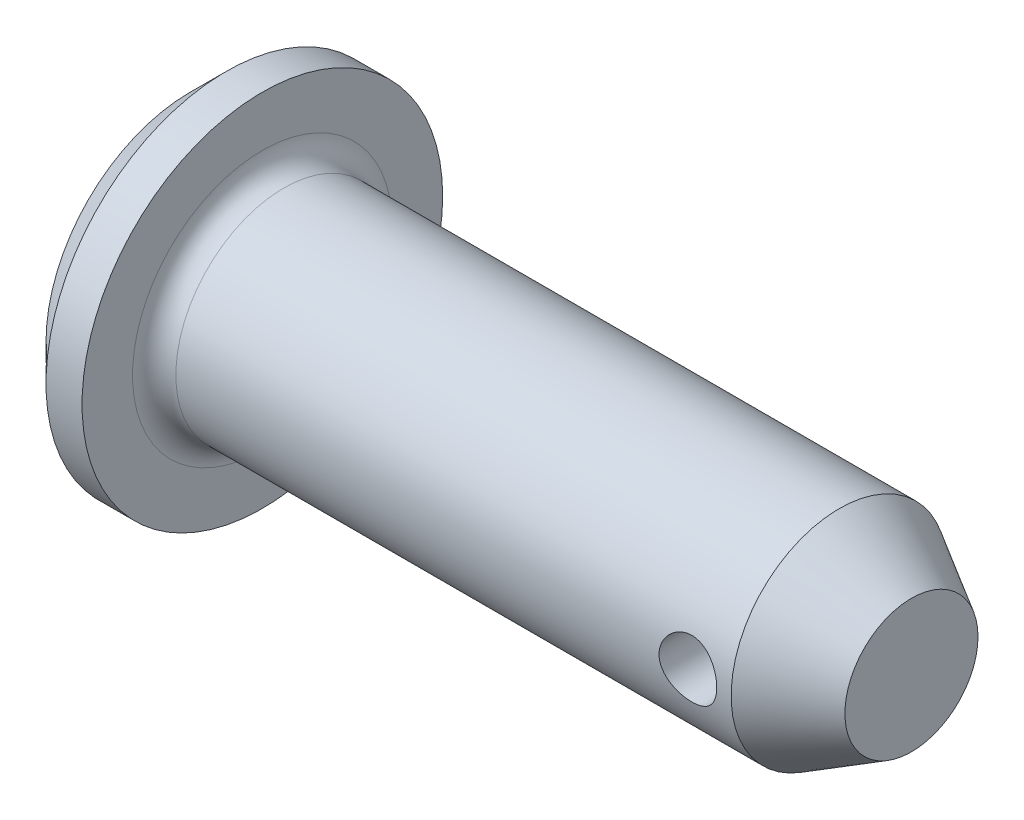
ISO-10303-21;
HEADER;
FILE_DESCRIPTION(('STEP AP214'),'2;1');
FILE_NAME('part.step','',(''),(''),'','','');
FILE_SCHEMA(('AUTOMOTIVE_DESIGN { 1 0 10303 214 1 1 1 1 }'));
ENDSEC;
DATA;
#1=APPLICATION_CONTEXT('core data for automotive mechanical design processes');
#2=APPLICATION_PROTOCOL_DEFINITION('international standard','automotive_design',2000,#1);
#3=PRODUCT_CONTEXT('',#1,'mechanical');
#4=PRODUCT('Part','Part','',(#3));
#5=PRODUCT_RELATED_PRODUCT_CATEGORY('part','',(#4));
#6=PRODUCT_DEFINITION_FORMATION('','',#4);
#7=PRODUCT_DEFINITION_CONTEXT('part definition',#1,'design');
#8=PRODUCT_DEFINITION('design','',#6,#7);
#9=PRODUCT_DEFINITION_SHAPE('','',#8);
#10=(LENGTH_UNIT() NAMED_UNIT(*) SI_UNIT(.MILLI.,.METRE.));
#11=(NAMED_UNIT(*) PLANE_ANGLE_UNIT() SI_UNIT($,.RADIAN.));
#12=(NAMED_UNIT(*) SI_UNIT($,.STERADIAN.) SOLID_ANGLE_UNIT());
#13=UNCERTAINTY_MEASURE_WITH_UNIT(LENGTH_MEASURE(1.E-05),#10,'distance_accuracy_value','');
#14=(GEOMETRIC_REPRESENTATION_CONTEXT(3) GLOBAL_UNCERTAINTY_ASSIGNED_CONTEXT((#13)) GLOBAL_UNIT_ASSIGNED_CONTEXT((#10,
#11,#12)) REPRESENTATION_CONTEXT('',''));
#15=CARTESIAN_POINT('',(0.,0.,0.));
#16=DIRECTION('',(0.,0.,1.));
#17=DIRECTION('',(1.,0.,0.));
#18=AXIS2_PLACEMENT_3D('',#15,#16,#17);
#19=CARTESIAN_POINT('',(0.,0.,0.));
#20=DIRECTION('',(-1.,0.,0.));
#21=DIRECTION('',(0.,0.,1.));
#22=AXIS2_PLACEMENT_3D('',#19,#20,#21);
#23=PLANE('',#22);
#24=CARTESIAN_POINT('',(0.,0.,0.));
#25=DIRECTION('',(1.,0.,0.));
#26=DIRECTION('',(0.,0.,-1.));
#27=AXIS2_PLACEMENT_3D('',#24,#25,#26);
#28=CIRCLE('',#27,4.);
#29=CARTESIAN_POINT('',(0.,0.,-4.));
#30=VERTEX_POINT('',#29);
#31=EDGE_CURVE('E61',#30,#30,#28,.T.);
#32=ORIENTED_EDGE('',*,*,#31,.F.);
#33=EDGE_LOOP('',(#32));
#34=FACE_BOUND('',#33,.T.);
#35=ADVANCED_FACE('F38',(#34),#23,.T.);
#36=CARTESIAN_POINT('',(1.,0.,0.));
#37=DIRECTION('',(1.,0.,0.));
#38=DIRECTION('',(0.,0.,-1.));
#39=AXIS2_PLACEMENT_3D('',#36,#37,#38);
#40=CONICAL_SURFACE('',#39,5.,0.785398163397448);
#41=ORIENTED_EDGE('',*,*,#31,.T.);
#42=EDGE_LOOP('',(#41));
#43=FACE_BOUND('',#42,.T.);
#44=CARTESIAN_POINT('',(1.,0.,0.));
#45=DIRECTION('',(1.,0.,0.));
#46=DIRECTION('',(0.,0.,-1.));
#47=AXIS2_PLACEMENT_3D('',#44,#45,#46);
#48=CIRCLE('',#47,5.);
#49=CARTESIAN_POINT('',(1.,0.,-5.));
#50=VERTEX_POINT('',#49);
#51=EDGE_CURVE('E126',#50,#50,#48,.T.);
#52=ORIENTED_EDGE('',*,*,#51,.F.);
#53=EDGE_LOOP('',(#52));
#54=FACE_BOUND('',#53,.T.);
#55=ADVANCED_FACE('F93',(#43,#54),#40,.T.);
#56=CARTESIAN_POINT('',(0.,0.,0.));
#57=DIRECTION('',(1.,0.,0.));
#58=DIRECTION('',(0.,0.,-1.));
#59=AXIS2_PLACEMENT_3D('',#56,#57,#58);
#60=CYLINDRICAL_SURFACE('',#59,5.);
#61=ORIENTED_EDGE('',*,*,#51,.T.);
#62=EDGE_LOOP('',(#61));
#63=FACE_BOUND('',#62,.T.);
#64=CARTESIAN_POINT('',(2.,0.,0.));
#65=DIRECTION('',(1.,0.,0.));
#66=DIRECTION('',(0.,0.,-1.));
#67=AXIS2_PLACEMENT_3D('',#64,#65,#66);
#68=CIRCLE('',#67,5.);
#69=CARTESIAN_POINT('',(2.,0.,-5.));
#70=VERTEX_POINT('',#69);
#71=EDGE_CURVE('E70',#70,#70,#68,.T.);
#72=ORIENTED_EDGE('',*,*,#71,.F.);
#73=EDGE_LOOP('',(#72));
#74=FACE_BOUND('',#73,.T.);
#75=ADVANCED_FACE('F99',(#63,#74),#60,.T.);
#76=CARTESIAN_POINT('',(2.,5.,0.));
#77=DIRECTION('',(1.,0.,0.));
#78=DIRECTION('',(0.,0.,-1.));
#79=AXIS2_PLACEMENT_3D('',#76,#77,#78);
#80=PLANE('',#79);
#81=CARTESIAN_POINT('',(2.,0.,0.));
#82=DIRECTION('',(1.,0.,0.));
#83=DIRECTION('',(0.,0.,-1.));
#84=AXIS2_PLACEMENT_3D('',#81,#82,#83);
#85=CIRCLE('',#84,3.6);
#86=CARTESIAN_POINT('',(2.,0.,-3.6));
#87=VERTEX_POINT('',#86);
#88=EDGE_CURVE('E50',#87,#87,#85,.F.);
#89=ORIENTED_EDGE('',*,*,#88,.T.);
#90=EDGE_LOOP('',(#89));
#91=FACE_BOUND('',#90,.T.);
#92=ORIENTED_EDGE('',*,*,#71,.T.);
#93=EDGE_LOOP('',(#92));
#94=FACE_BOUND('',#93,.T.);
#95=ADVANCED_FACE('F91',(#91,#94),#80,.T.);
#96=CARTESIAN_POINT('',(0.,0.,0.));
#97=DIRECTION('',(1.,0.,0.));
#98=DIRECTION('',(0.,0.,-1.));
#99=AXIS2_PLACEMENT_3D('',#96,#97,#98);
#100=CYLINDRICAL_SURFACE('',#99,3.);
#101=CARTESIAN_POINT('',(18.,0.,0.));
#102=DIRECTION('',(1.,0.,0.));
#103=DIRECTION('',(0.,0.,-1.));
#104=AXIS2_PLACEMENT_3D('',#101,#102,#103);
#105=CIRCLE('',#104,3.);
#106=CARTESIAN_POINT('',(18.,0.,-3.));
#107=VERTEX_POINT('',#106);
#108=EDGE_CURVE('E10',#107,#107,#105,.F.);
#109=ORIENTED_EDGE('',*,*,#108,.T.);
#110=EDGE_LOOP('',(#109));
#111=FACE_BOUND('',#110,.T.);
#112=CARTESIAN_POINT('',(2.6,0.,0.));
#113=DIRECTION('',(1.,0.,0.));
#114=DIRECTION('',(0.,0.,-1.));
#115=AXIS2_PLACEMENT_3D('',#112,#113,#114);
#116=CIRCLE('',#115,3.);
#117=CARTESIAN_POINT('',(2.6,0.,-3.));
#118=VERTEX_POINT('',#117);
#119=EDGE_CURVE('E56',#118,#118,#116,.T.);
#120=ORIENTED_EDGE('',*,*,#119,.T.);
#121=EDGE_LOOP('',(#120));
#122=FACE_BOUND('',#121,.T.);
#123=CARTESIAN_POINT('',(16.,0.,-3.));
#124=CARTESIAN_POINT('',(16.000001046774,0.0441018223331417,-2.99999933524065));
#125=CARTESIAN_POINT('',(16.0036590456759,0.0882148640887363,-2.99901794464862));
#126=CARTESIAN_POINT('',(16.0181684922955,0.175170180541785,-2.99519829448663));
#127=CARTESIAN_POINT('',(16.0290234017705,0.218011833327634,-2.9923591413303));
#128=CARTESIAN_POINT('',(16.0575486667456,0.301156635618125,-2.98513733301121));
#129=CARTESIAN_POINT('',(16.0752102350664,0.341462980406115,-2.98075666852169));
#130=CARTESIAN_POINT('',(16.1168148970667,0.418541474557063,-2.97091479660652));
#131=CARTESIAN_POINT('',(16.1407584093437,0.455313388179847,-2.96545351718002));
#132=CARTESIAN_POINT('',(16.1948334065654,0.525131801496009,-2.95389845960869));
#133=CARTESIAN_POINT('',(16.2250834672034,0.558084675945125,-2.9477938707174));
#134=CARTESIAN_POINT('',(16.2906593932253,0.618514854642539,-2.93570963871569));
#135=CARTESIAN_POINT('',(16.3259859110467,0.645991453982615,-2.92973001177899));
#136=CARTESIAN_POINT('',(16.4014592939305,0.695145636973702,-2.91846214986765));
#137=CARTESIAN_POINT('',(16.4416785313059,0.716715510946109,-2.91318755429117));
#138=CARTESIAN_POINT('',(16.5253360444358,0.752750192307817,-2.90408590923454));
#139=CARTESIAN_POINT('',(16.5687737249281,0.76721630980488,-2.9002585928704));
#140=CARTESIAN_POINT('',(16.6565982151307,0.788307680905699,-2.89459646334927));
#141=CARTESIAN_POINT('',(16.7009414159809,0.795102680979743,-2.89271859176123));
#142=CARTESIAN_POINT('',(16.7901750733332,0.801188138824369,-2.89103932417876));
#143=CARTESIAN_POINT('',(16.8350654260143,0.800479998822943,-2.89123754019361));
#144=CARTESIAN_POINT('',(16.922794166149,0.791714040010483,-2.89364951507619));
#145=CARTESIAN_POINT('',(16.9656548728152,0.783861624258974,-2.89580694201076));
#146=CARTESIAN_POINT('',(17.0494273337827,0.761358994888815,-2.90180405235812));
#147=CARTESIAN_POINT('',(17.0903389320302,0.746708237972001,-2.90564387021998));
#148=CARTESIAN_POINT('',(17.1695872575234,0.710857427860999,-2.91462264698391));
#149=CARTESIAN_POINT('',(17.2078897357145,0.68958536455113,-2.91977577127223));
#150=CARTESIAN_POINT('',(17.2804536635406,0.641146015295114,-2.93079291857237));
#151=CARTESIAN_POINT('',(17.3147143156626,0.613977568897005,-2.93665708142145));
#152=CARTESIAN_POINT('',(17.3793955989819,0.553466429053672,-2.94867004251873));
#153=CARTESIAN_POINT('',(17.409654527326,0.519951250913194,-2.95482188595513));
#154=CARTESIAN_POINT('',(17.4641555121401,0.448247067282547,-2.96654552510546));
#155=CARTESIAN_POINT('',(17.488397331481,0.410057877682035,-2.97211729795427));
#156=CARTESIAN_POINT('',(17.5302471611299,0.32983930219898,-2.98208728159312));
#157=CARTESIAN_POINT('',(17.5478259081794,0.287793961020715,-2.98648029133423));
#158=CARTESIAN_POINT('',(17.5756188755254,0.201200917756158,-2.99356017760401));
#159=CARTESIAN_POINT('',(17.5858347050896,0.15665376477133,-2.996247426935));
#160=CARTESIAN_POINT('',(17.5983579507671,0.0677016332582064,-2.99955663423354));
#161=CARTESIAN_POINT('',(17.6008852159404,0.0233296950565524,-3.00023598988385));
#162=CARTESIAN_POINT('',(17.5985667343012,-0.0652040183604785,-2.99961788676677));
#163=CARTESIAN_POINT('',(17.5937217495577,-0.109365814824844,-2.99832063232137));
#164=CARTESIAN_POINT('',(17.576976621016,-0.195440979960712,-2.99393214198412));
#165=CARTESIAN_POINT('',(17.5651991015209,-0.237379940811116,-2.99087210618547));
#166=CARTESIAN_POINT('',(17.5350656221968,-0.318682788470423,-2.98330517957641));
#167=CARTESIAN_POINT('',(17.5167089494998,-0.358046395686399,-2.9787981319841));
#168=CARTESIAN_POINT('',(17.4735304451278,-0.433935389867192,-2.96870264223867));
#169=CARTESIAN_POINT('',(17.4485890132808,-0.470390075384519,-2.96309474642193));
#170=CARTESIAN_POINT('',(17.3930993479369,-0.538673854158811,-2.95144580946015));
#171=CARTESIAN_POINT('',(17.3625500069601,-0.570502031519496,-2.94540468290222));
#172=CARTESIAN_POINT('',(17.2956857690017,-0.629555697915274,-2.9333589834749));
#173=CARTESIAN_POINT('',(17.2592325754399,-0.656626076999943,-2.92736024574782));
#174=CARTESIAN_POINT('',(17.1821741215621,-0.704268764739793,-2.91626578870035));
#175=CARTESIAN_POINT('',(17.1415690345585,-0.724841344486106,-2.91117003171109));
#176=CARTESIAN_POINT('',(17.0575618771647,-0.758749646345943,-2.9025170736066));
#177=CARTESIAN_POINT('',(17.0141776752508,-0.772127249023589,-2.89895099369493));
#178=CARTESIAN_POINT('',(16.9256642721065,-0.791364820483171,-2.89375930092876));
#179=CARTESIAN_POINT('',(16.8805355198532,-0.797226710411951,-2.89213319219128));
#180=CARTESIAN_POINT('',(16.791402084851,-0.801155958613011,-2.89104697818674));
#181=CARTESIAN_POINT('',(16.7474090718979,-0.799472622471939,-2.89151759094413));
#182=CARTESIAN_POINT('',(16.6603585943948,-0.788937504002248,-2.89440958435318));
#183=CARTESIAN_POINT('',(16.6173011057995,-0.780085906140232,-2.89683091480545));
#184=CARTESIAN_POINT('',(16.5336576991484,-0.755610062798664,-2.903310284285));
#185=CARTESIAN_POINT('',(16.4930552629072,-0.740038644302282,-2.90735554007653));
#186=CARTESIAN_POINT('',(16.4150084677863,-0.702606218249576,-2.91662727254676));
#187=CARTESIAN_POINT('',(16.3775646054798,-0.680744224098474,-2.92185393448601));
#188=CARTESIAN_POINT('',(16.3057078562014,-0.630595637075256,-2.93309168576127));
#189=CARTESIAN_POINT('',(16.2714165860095,-0.602138919071633,-2.93912133240661));
#190=CARTESIAN_POINT('',(16.2080150193331,-0.5399322140444,-2.95118201513218));
#191=CARTESIAN_POINT('',(16.1789059845325,-0.506180941743496,-2.95721305119381));
#192=CARTESIAN_POINT('',(16.1260831049413,-0.43347199243547,-2.96875124961583));
#193=CARTESIAN_POINT('',(16.1024979957403,-0.39441838470071,-2.97424444525819));
#194=CARTESIAN_POINT('',(16.0622650336283,-0.312755456166756,-2.9839352404116));
#195=CARTESIAN_POINT('',(16.0456127297346,-0.270148437878519,-2.98813367073438));
#196=CARTESIAN_POINT('',(16.0218898858338,-0.189749881952397,-2.99421901005387));
#197=CARTESIAN_POINT('',(16.013700246563,-0.152304806626014,-2.99637108237041));
#198=CARTESIAN_POINT('',(16.0027551175332,-0.0765759181268303,-2.99926179614582));
#199=CARTESIAN_POINT('',(15.99999909112,-0.0382921881619441,-3.00000057718908));
#200=CARTESIAN_POINT('',(16.,0.,-3.));
#201=B_SPLINE_CURVE_WITH_KNOTS('',3,(#123,#124,#125,#126,#127,#128,#129,#130,#131,#132,#133,
#134,#135,#136,#137,#138,#139,#140,#141,#142,#143,#144,#145,#146,#147,#148,#149,#150,#151,#152,
#153,#154,#155,#156,#157,#158,#159,#160,#161,#162,#163,#164,#165,#166,#167,#168,#169,#170,#171,
#172,#173,#174,#175,#176,#177,#178,#179,#180,#181,#182,#183,#184,#185,#186,#187,#188,#189,#190,
#191,#192,#193,#194,#195,#196,#197,#198,#199,#200),.UNSPECIFIED.,.T.,.F.,(4,2,2,2,2,2,2,2,2,2,2,
2,2,2,2,2,2,2,2,2,2,2,2,2,2,2,2,2,2,2,2,2,2,2,2,2,2,2,4),(0.,0.132165039579827,0.26439369750458,
0.396452221188774,0.5285195468347,0.663339591819866,0.798176979700596,0.935330330092919,
1.0724583765188,1.20648863299035,1.34049384159393,1.47076400816064,1.60104458722841,
1.73279469336265,1.86457075244718,2.00064503922594,2.13672468772704,2.27339523838882,
2.41003590873721,2.54273087007484,2.67541211567806,2.80581414254512,2.93623030307911,
3.06920114399485,3.2021982730122,3.33894598550781,3.47568799207308,3.61162519076595,
3.7475276346153,3.87897336957382,4.01041572204175,4.14084306175258,4.27129086845138,
4.40557735824493,4.53989649728916,4.67708900908296,4.81419330454009,4.92895927593271,
5.0437139118249),.UNSPECIFIED.);
#202=CARTESIAN_POINT('',(16.,0.,-3.));
#203=VERTEX_POINT('',#202);
#204=EDGE_CURVE('E62',#203,#203,#201,.T.);
#205=ORIENTED_EDGE('',*,*,#204,.F.);
#206=EDGE_LOOP('',(#205));
#207=FACE_BOUND('',#206,.T.);
#208=CARTESIAN_POINT('',(17.6,0.,3.));
#209=CARTESIAN_POINT('',(17.5999989532261,0.0441018223331417,2.99999933524065));
#210=CARTESIAN_POINT('',(17.5963409543241,0.0882148640887363,2.99901794464862));
#211=CARTESIAN_POINT('',(17.5818315077045,0.175170180541785,2.99519829448663));
#212=CARTESIAN_POINT('',(17.5709765982296,0.218011833327634,2.9923591413303));
#213=CARTESIAN_POINT('',(17.5424513332544,0.301156635618125,2.98513733301121));
#214=CARTESIAN_POINT('',(17.5247897649336,0.341462980406115,2.98075666852169));
#215=CARTESIAN_POINT('',(17.4831851029334,0.418541474557063,2.97091479660652));
#216=CARTESIAN_POINT('',(17.4592415906563,0.455313388179847,2.96545351718002));
#217=CARTESIAN_POINT('',(17.4051665934346,0.525131801496009,2.95389845960869));
#218=CARTESIAN_POINT('',(17.3749165327966,0.558084675945125,2.9477938707174));
#219=CARTESIAN_POINT('',(17.3093406067748,0.618514854642539,2.93570963871569));
#220=CARTESIAN_POINT('',(17.2740140889533,0.645991453982615,2.92973001177899));
#221=CARTESIAN_POINT('',(17.1985407060695,0.695145636973702,2.91846214986765));
#222=CARTESIAN_POINT('',(17.1583214686941,0.716715510946109,2.91318755429117));
#223=CARTESIAN_POINT('',(17.0746639555642,0.752750192307817,2.90408590923454));
#224=CARTESIAN_POINT('',(17.0312262750719,0.76721630980488,2.9002585928704));
#225=CARTESIAN_POINT('',(16.9434017848694,0.7883076809057,2.89459646334927));
#226=CARTESIAN_POINT('',(16.8990585840191,0.795102680979744,2.89271859176123));
#227=CARTESIAN_POINT('',(16.8098249266668,0.801188138824369,2.89103932417876));
#228=CARTESIAN_POINT('',(16.7649345739858,0.800479998822942,2.89123754019361));
#229=CARTESIAN_POINT('',(16.6772058338511,0.791714040010483,2.89364951507619));
#230=CARTESIAN_POINT('',(16.6343451271848,0.783861624258974,2.89580694201076));
#231=CARTESIAN_POINT('',(16.5505726662173,0.761358994888815,2.90180405235812));
#232=CARTESIAN_POINT('',(16.5096610679698,0.746708237972001,2.90564387021998));
#233=CARTESIAN_POINT('',(16.4304127424766,0.710857427860999,2.91462264698391));
#234=CARTESIAN_POINT('',(16.3921102642855,0.68958536455113,2.91977577127223));
#235=CARTESIAN_POINT('',(16.3195463364594,0.641146015295114,2.93079291857237));
#236=CARTESIAN_POINT('',(16.2852856843374,0.613977568897005,2.93665708142145));
#237=CARTESIAN_POINT('',(16.2206044010181,0.553466429053672,2.94867004251873));
#238=CARTESIAN_POINT('',(16.190345472674,0.519951250913194,2.95482188595513));
#239=CARTESIAN_POINT('',(16.1358444878599,0.448247067282547,2.96654552510546));
#240=CARTESIAN_POINT('',(16.111602668519,0.410057877682035,2.97211729795427));
#241=CARTESIAN_POINT('',(16.0697528388702,0.32983930219898,2.98208728159312));
#242=CARTESIAN_POINT('',(16.0521740918206,0.287793961020715,2.98648029133423));
#243=CARTESIAN_POINT('',(16.0243811244747,0.201200917756158,2.99356017760401));
#244=CARTESIAN_POINT('',(16.0141652949104,0.15665376477133,2.996247426935));
#245=CARTESIAN_POINT('',(16.0016420492329,0.0677016332582064,2.99955663423354));
#246=CARTESIAN_POINT('',(15.9991147840597,0.0233296950565524,3.00023598988385));
#247=CARTESIAN_POINT('',(16.0014332656988,-0.0652040183604785,2.99961788676677));
#248=CARTESIAN_POINT('',(16.0062782504423,-0.109365814824844,2.99832063232137));
#249=CARTESIAN_POINT('',(16.023023378984,-0.195440979960712,2.99393214198412));
#250=CARTESIAN_POINT('',(16.0348008984791,-0.237379940811116,2.99087210618547));
#251=CARTESIAN_POINT('',(16.0649343778032,-0.318682788470423,2.98330517957641));
#252=CARTESIAN_POINT('',(16.0832910505002,-0.358046395686399,2.9787981319841));
#253=CARTESIAN_POINT('',(16.1264695548723,-0.433935389867192,2.96870264223867));
#254=CARTESIAN_POINT('',(16.1514109867192,-0.470390075384519,2.96309474642193));
#255=CARTESIAN_POINT('',(16.2069006520631,-0.538673854158811,2.95144580946015));
#256=CARTESIAN_POINT('',(16.2374499930399,-0.570502031519496,2.94540468290222));
#257=CARTESIAN_POINT('',(16.3043142309984,-0.629555697915274,2.9333589834749));
#258=CARTESIAN_POINT('',(16.3407674245601,-0.656626076999943,2.92736024574782));
#259=CARTESIAN_POINT('',(16.4178258784379,-0.704268764739793,2.91626578870035));
#260=CARTESIAN_POINT('',(16.4584309654415,-0.724841344486106,2.91117003171109));
#261=CARTESIAN_POINT('',(16.5424381228353,-0.758749646345943,2.9025170736066));
#262=CARTESIAN_POINT('',(16.5858223247493,-0.772127249023589,2.89895099369493));
#263=CARTESIAN_POINT('',(16.6743357278935,-0.791364820483171,2.89375930092876));
#264=CARTESIAN_POINT('',(16.7194644801468,-0.797226710411951,2.89213319219128));
#265=CARTESIAN_POINT('',(16.808597915149,-0.801155958613011,2.89104697818674));
#266=CARTESIAN_POINT('',(16.8525909281021,-0.799472622471939,2.89151759094413));
#267=CARTESIAN_POINT('',(16.9396414056052,-0.788937504002248,2.89440958435318));
#268=CARTESIAN_POINT('',(16.9826988942006,-0.780085906140232,2.89683091480545));
#269=CARTESIAN_POINT('',(17.0663423008516,-0.755610062798665,2.903310284285));
#270=CARTESIAN_POINT('',(17.1069447370928,-0.740038644302283,2.90735554007653));
#271=CARTESIAN_POINT('',(17.1849915322138,-0.702606218249578,2.91662727254676));
#272=CARTESIAN_POINT('',(17.2224353945202,-0.680744224098474,2.92185393448601));
#273=CARTESIAN_POINT('',(17.2942921437986,-0.630595637075256,2.93309168576127));
#274=CARTESIAN_POINT('',(17.3285834139905,-0.602138919071633,2.93912133240661));
#275=CARTESIAN_POINT('',(17.3919849806669,-0.5399322140444,2.95118201513218));
#276=CARTESIAN_POINT('',(17.4210940154675,-0.506180941743496,2.95721305119381));
#277=CARTESIAN_POINT('',(17.4739168950588,-0.43347199243547,2.96875124961583));
#278=CARTESIAN_POINT('',(17.4975020042597,-0.39441838470071,2.97424444525819));
#279=CARTESIAN_POINT('',(17.5377349663718,-0.312755456166756,2.9839352404116));
#280=CARTESIAN_POINT('',(17.5543872702654,-0.270148437878519,2.98813367073438));
#281=CARTESIAN_POINT('',(17.5781101141662,-0.189749881952397,2.99421901005387));
#282=CARTESIAN_POINT('',(17.586299753437,-0.152304806626014,2.99637108237041));
#283=CARTESIAN_POINT('',(17.5972448824668,-0.0765759181268303,2.99926179614582));
#284=CARTESIAN_POINT('',(17.60000090888,-0.0382921881619441,3.00000057718908));
#285=CARTESIAN_POINT('',(17.6,0.,3.));
#286=B_SPLINE_CURVE_WITH_KNOTS('',3,(#208,#209,#210,#211,#212,#213,#214,#215,#216,#217,#218,
#219,#220,#221,#222,#223,#224,#225,#226,#227,#228,#229,#230,#231,#232,#233,#234,#235,#236,#237,
#238,#239,#240,#241,#242,#243,#244,#245,#246,#247,#248,#249,#250,#251,#252,#253,#254,#255,#256,
#257,#258,#259,#260,#261,#262,#263,#264,#265,#266,#267,#268,#269,#270,#271,#272,#273,#274,#275,
#276,#277,#278,#279,#280,#281,#282,#283,#284,#285),.UNSPECIFIED.,.T.,.F.,(4,2,2,2,2,2,2,2,2,2,2,
2,2,2,2,2,2,2,2,2,2,2,2,2,2,2,2,2,2,2,2,2,2,2,2,2,2,2,4),(0.,0.132165039579827,0.26439369750458,
0.396452221188774,0.5285195468347,0.663339591819866,0.798176979700596,0.935330330092919,
1.0724583765188,1.20648863299035,1.34049384159393,1.47076400816064,1.60104458722841,
1.73279469336265,1.86457075244718,2.00064503922594,2.13672468772704,2.27339523838882,
2.41003590873721,2.54273087007484,2.67541211567806,2.80581414254512,2.93623030307911,
3.06920114399485,3.2021982730122,3.33894598550781,3.47568799207308,3.61162519076595,
3.7475276346153,3.87897336957382,4.01041572204175,4.14084306175258,4.27129086845138,
4.40557735824493,4.53989649728916,4.67708900908296,4.81419330454009,4.92895927593271,
5.0437139118249),.UNSPECIFIED.);
#287=CARTESIAN_POINT('',(17.6,0.,3.));
#288=VERTEX_POINT('',#287);
#289=EDGE_CURVE('E71',#288,#288,#286,.T.);
#290=ORIENTED_EDGE('',*,*,#289,.F.);
#291=EDGE_LOOP('',(#290));
#292=FACE_BOUND('',#291,.T.);
#293=ADVANCED_FACE('F76',(#111,#122,#207,#292),#100,.T.);
#294=CARTESIAN_POINT('',(20.,3.,0.));
#295=DIRECTION('',(1.,0.,0.));
#296=DIRECTION('',(0.,0.,-1.));
#297=AXIS2_PLACEMENT_3D('',#294,#295,#296);
#298=PLANE('',#297);
#299=CARTESIAN_POINT('',(20.,0.,0.));
#300=DIRECTION('',(1.,0.,0.));
#301=DIRECTION('',(0.,0.,-1.));
#302=AXIS2_PLACEMENT_3D('',#299,#300,#301);
#303=CIRCLE('',#302,1.84529946162075);
#304=CARTESIAN_POINT('',(20.,0.,-1.84529946162075));
#305=VERTEX_POINT('',#304);
#306=EDGE_CURVE('E45',#305,#305,#303,.T.);
#307=ORIENTED_EDGE('',*,*,#306,.T.);
#308=EDGE_LOOP('',(#307));
#309=FACE_BOUND('',#308,.T.);
#310=ADVANCED_FACE('F84',(#309),#298,.T.);
#311=CARTESIAN_POINT('',(16.8,0.,-5.));
#312=DIRECTION('',(0.,0.,1.));
#313=DIRECTION('',(1.,0.,0.));
#314=AXIS2_PLACEMENT_3D('',#311,#312,#313);
#315=CYLINDRICAL_SURFACE('',#314,0.799999999999999);
#316=ORIENTED_EDGE('',*,*,#204,.T.);
#317=EDGE_LOOP('',(#316));
#318=FACE_BOUND('',#317,.T.);
#319=ORIENTED_EDGE('',*,*,#289,.T.);
#320=EDGE_LOOP('',(#319));
#321=FACE_BOUND('',#320,.T.);
#322=ADVANCED_FACE('F80',(#318,#321),#315,.F.);
#323=CARTESIAN_POINT('',(2.6,0.,0.));
#324=DIRECTION('',(1.,0.,0.));
#325=DIRECTION('',(0.,0.,-1.));
#326=AXIS2_PLACEMENT_3D('',#323,#324,#325);
#327=TOROIDAL_SURFACE('',#326,3.6,0.6);
#328=ORIENTED_EDGE('',*,*,#88,.F.);
#329=EDGE_LOOP('',(#328));
#330=FACE_BOUND('',#329,.T.);
#331=ORIENTED_EDGE('',*,*,#119,.F.);
#332=EDGE_LOOP('',(#331));
#333=FACE_BOUND('',#332,.T.);
#334=ADVANCED_FACE('F83',(#330,#333),#327,.F.);
#335=CARTESIAN_POINT('',(20.,0.,0.));
#336=DIRECTION('',(-1.,0.,0.));
#337=DIRECTION('',(0.,0.,1.));
#338=AXIS2_PLACEMENT_3D('',#335,#336,#337);
#339=CONICAL_SURFACE('',#338,1.84529946162075,0.523598775598297);
#340=ORIENTED_EDGE('',*,*,#108,.F.);
#341=EDGE_LOOP('',(#340));
#342=FACE_BOUND('',#341,.T.);
#343=ORIENTED_EDGE('',*,*,#306,.F.);
#344=EDGE_LOOP('',(#343));
#345=FACE_BOUND('',#344,.T.);
#346=ADVANCED_FACE('F40',(#342,#345),#339,.T.);
#347=CLOSED_SHELL('',(#35,#55,#75,#95,#293,#310,#322,#334,#346));
#348=MANIFOLD_SOLID_BREP('B2',#347);
#349=ADVANCED_BREP_SHAPE_REPRESENTATION('',(#18,#348),#14);
#350=SHAPE_DEFINITION_REPRESENTATION(#9,#349);
ENDSEC;
END-ISO-10303-21;
